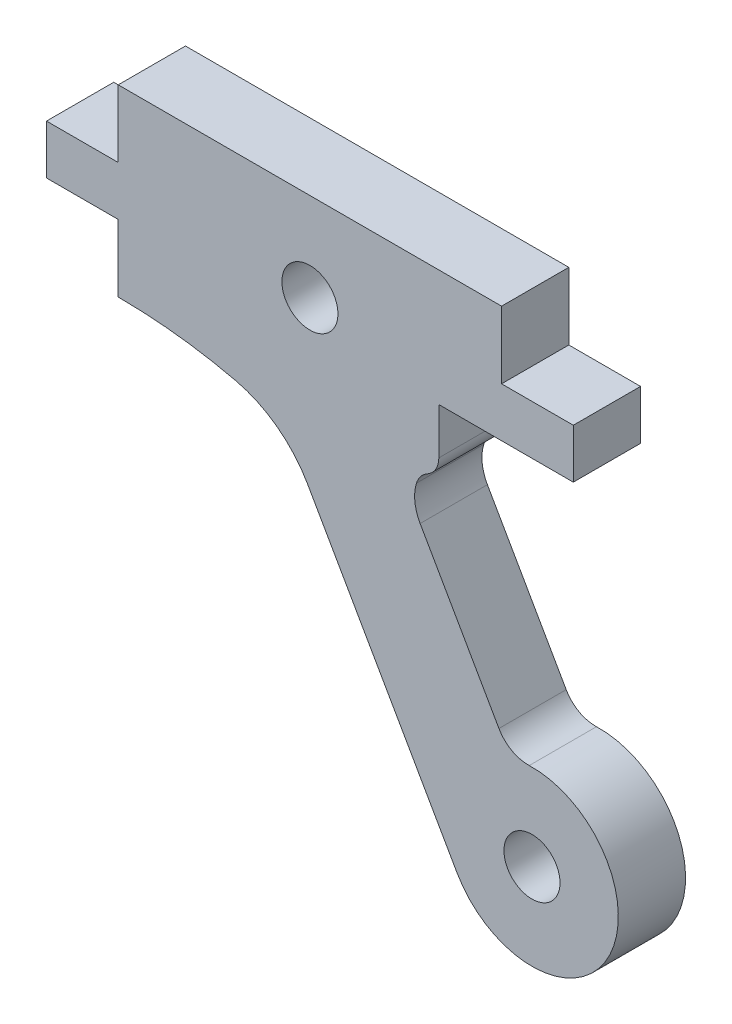
ISO-10303-21;
HEADER;
FILE_DESCRIPTION(('STEP AP214'),'2;1');
FILE_NAME('part.step','',(''),(''),'','','');
FILE_SCHEMA(('AUTOMOTIVE_DESIGN { 1 0 10303 214 1 1 1 1 }'));
ENDSEC;
DATA;
#1=APPLICATION_CONTEXT('core data for automotive mechanical design processes');
#2=APPLICATION_PROTOCOL_DEFINITION('international standard','automotive_design',2000,#1);
#3=PRODUCT_CONTEXT('',#1,'mechanical');
#4=PRODUCT('Part','Part','',(#3));
#5=PRODUCT_RELATED_PRODUCT_CATEGORY('part','',(#4));
#6=PRODUCT_DEFINITION_FORMATION('','',#4);
#7=PRODUCT_DEFINITION_CONTEXT('part definition',#1,'design');
#8=PRODUCT_DEFINITION('design','',#6,#7);
#9=PRODUCT_DEFINITION_SHAPE('','',#8);
#10=(LENGTH_UNIT() NAMED_UNIT(*) SI_UNIT(.MILLI.,.METRE.));
#11=(NAMED_UNIT(*) PLANE_ANGLE_UNIT() SI_UNIT($,.RADIAN.));
#12=(NAMED_UNIT(*) SI_UNIT($,.STERADIAN.) SOLID_ANGLE_UNIT());
#13=UNCERTAINTY_MEASURE_WITH_UNIT(LENGTH_MEASURE(1.E-05),#10,'distance_accuracy_value','');
#14=(GEOMETRIC_REPRESENTATION_CONTEXT(3) GLOBAL_UNCERTAINTY_ASSIGNED_CONTEXT((#13)) GLOBAL_UNIT_ASSIGNED_CONTEXT((#10,
#11,#12)) REPRESENTATION_CONTEXT('',''));
#15=CARTESIAN_POINT('',(0.,0.,0.));
#16=DIRECTION('',(0.,0.,1.));
#17=DIRECTION('',(1.,0.,0.));
#18=AXIS2_PLACEMENT_3D('',#15,#16,#17);
#19=CARTESIAN_POINT('',(-8.5499999999949,-27.1930824881454,3.));
#20=DIRECTION('',(0.,0.,1.));
#21=DIRECTION('',(1.,0.,0.));
#22=AXIS2_PLACEMENT_3D('',#19,#20,#21);
#23=PLANE('',#22);
#24=CARTESIAN_POINT('',(9.90717122357579,-17.027564662827,3.));
#25=DIRECTION('',(0.,0.,1.));
#26=DIRECTION('',(1.,0.,0.));
#27=AXIS2_PLACEMENT_3D('',#24,#25,#26);
#28=CIRCLE('',#27,1.25);
#29=CARTESIAN_POINT('',(11.1571712235758,-17.027564662827,3.));
#30=VERTEX_POINT('',#29);
#31=EDGE_CURVE('E205',#30,#30,#28,.T.);
#32=ORIENTED_EDGE('',*,*,#31,.F.);
#33=EDGE_LOOP('',(#32));
#34=FACE_BOUND('',#33,.T.);
#35=DIRECTION('',(-1.,0.,0.));
#36=VECTOR('',#35,1.);
#37=CARTESIAN_POINT('',(8.54999999999958,3.95000000000043,3.));
#38=LINE('',#37,#36);
#39=CARTESIAN_POINT('',(8.54999999999958,3.95000000000043,3.));
#40=VERTEX_POINT('',#39);
#41=CARTESIAN_POINT('',(-8.55000000000043,3.94999999999989,3.));
#42=VERTEX_POINT('',#41);
#43=EDGE_CURVE('E240',#40,#42,#38,.T.);
#44=ORIENTED_EDGE('',*,*,#43,.T.);
#45=DIRECTION('',(0.,-1.,0.));
#46=VECTOR('',#45,1.);
#47=CARTESIAN_POINT('',(-8.55000000000043,3.94999999999989,3.));
#48=LINE('',#47,#46);
#49=CARTESIAN_POINT('',(-8.55000000000035,0.949999999999882,3.));
#50=VERTEX_POINT('',#49);
#51=EDGE_CURVE('E128',#42,#50,#48,.T.);
#52=ORIENTED_EDGE('',*,*,#51,.T.);
#53=DIRECTION('',(-1.,0.,0.));
#54=VECTOR('',#53,1.);
#55=CARTESIAN_POINT('',(-8.55000000000035,0.949999999999882,3.));
#56=LINE('',#55,#54);
#57=CARTESIAN_POINT('',(-11.7500000000004,0.94999999999987,3.));
#58=VERTEX_POINT('',#57);
#59=EDGE_CURVE('E291',#50,#58,#56,.T.);
#60=ORIENTED_EDGE('',*,*,#59,.T.);
#61=DIRECTION('',(0.,-1.,0.));
#62=VECTOR('',#61,1.);
#63=CARTESIAN_POINT('',(-11.7500000000004,0.94999999999987,3.));
#64=LINE('',#63,#62);
#65=CARTESIAN_POINT('',(-11.7500000000003,-1.25000000000011,3.));
#66=VERTEX_POINT('',#65);
#67=EDGE_CURVE('E310',#58,#66,#64,.T.);
#68=ORIENTED_EDGE('',*,*,#67,.T.);
#69=DIRECTION('',(1.,0.,0.));
#70=VECTOR('',#69,1.);
#71=CARTESIAN_POINT('',(-11.7500000000003,-1.25000000000011,3.));
#72=LINE('',#71,#70);
#73=CARTESIAN_POINT('',(-8.5500000000003,-1.2500000000001,3.));
#74=VERTEX_POINT('',#73);
#75=EDGE_CURVE('E307',#66,#74,#72,.T.);
#76=ORIENTED_EDGE('',*,*,#75,.T.);
#77=DIRECTION('',(0.,-1.,0.));
#78=VECTOR('',#77,1.);
#79=CARTESIAN_POINT('',(-8.5500000000003,-1.2500000000001,3.));
#80=LINE('',#79,#78);
#81=CARTESIAN_POINT('',(-8.55000000000022,-4.25000000000021,3.));
#82=VERTEX_POINT('',#81);
#83=EDGE_CURVE('E309',#74,#82,#80,.T.);
#84=ORIENTED_EDGE('',*,*,#83,.T.);
#85=CARTESIAN_POINT('',(-8.5499999999949,-27.1930824881454,3.));
#86=DIRECTION('',(0.,0.,-1.));
#87=DIRECTION('',(1.,0.,0.));
#88=AXIS2_PLACEMENT_3D('',#85,#86,#87);
#89=CIRCLE('',#88,22.9430824881453);
#90=CARTESIAN_POINT('',(-3.30591056972596,-4.85735863362978,3.));
#91=VERTEX_POINT('',#90);
#92=EDGE_CURVE('E312',#82,#91,#89,.T.);
#93=ORIENTED_EDGE('',*,*,#92,.T.);
#94=CARTESIAN_POINT('',(-4.44990190647512,-9.72986794708752,3.));
#95=DIRECTION('',(0.,0.,-1.));
#96=DIRECTION('',(1.,0.,0.));
#97=AXIS2_PLACEMENT_3D('',#94,#95,#96);
#98=CIRCLE('',#97,5.00500381501255);
#99=CARTESIAN_POINT('',(-0.102452291666491,-7.25000000000033,3.));
#100=VERTEX_POINT('',#99);
#101=EDGE_CURVE('E318',#91,#100,#98,.T.);
#102=ORIENTED_EDGE('',*,*,#101,.T.);
#103=DIRECTION('',(0.495477733633113,-0.868620639562401,0.));
#104=VECTOR('',#103,1.);
#105=CARTESIAN_POINT('',(-0.102452291666477,-7.25000000000033,3.));
#106=LINE('',#105,#104);
#107=CARTESIAN_POINT('',(6.56298176126047,-18.9351539373144,3.));
#108=VERTEX_POINT('',#107);
#109=EDGE_CURVE('E320',#100,#108,#106,.T.);
#110=ORIENTED_EDGE('',*,*,#109,.T.);
#111=CARTESIAN_POINT('',(9.90717122357579,-17.027564662827,3.));
#112=DIRECTION('',(0.,0.,1.));
#113=DIRECTION('',(1.,0.,0.));
#114=AXIS2_PLACEMENT_3D('',#111,#112,#113);
#115=CIRCLE('',#114,3.85000000000012);
#116=CARTESIAN_POINT('',(9.78336880245243,-13.1795557022702,3.));
#117=VERTEX_POINT('',#116);
#118=EDGE_CURVE('E322',#108,#117,#115,.T.);
#119=ORIENTED_EDGE('',*,*,#118,.T.);
#120=CARTESIAN_POINT('',(9.73513409292387,-11.6803314319235,3.));
#121=DIRECTION('',(0.,0.,-1.));
#122=DIRECTION('',(1.,0.,0.));
#123=AXIS2_PLACEMENT_3D('',#120,#121,#122);
#124=CIRCLE('',#123,1.49999999999998);
#125=CARTESIAN_POINT('',(8.43220313358019,-12.423548032373,3.));
#126=VERTEX_POINT('',#125);
#127=EDGE_CURVE('E324',#117,#126,#124,.T.);
#128=ORIENTED_EDGE('',*,*,#127,.T.);
#129=DIRECTION('',(-0.495477733633112,0.868620639562401,0.));
#130=VECTOR('',#129,1.);
#131=CARTESIAN_POINT('',(8.43220313358015,-12.423548032373,3.));
#132=LINE('',#131,#130);
#133=CARTESIAN_POINT('',(4.91779770312153,-6.26245362697442,3.));
#134=VERTEX_POINT('',#133);
#135=EDGE_CURVE('E326',#126,#134,#132,.T.);
#136=ORIENTED_EDGE('',*,*,#135,.T.);
#137=CARTESIAN_POINT('',(6.54173589386581,-5.33612839630127,3.));
#138=DIRECTION('',(0.,0.,-1.));
#139=DIRECTION('',(1.,0.,0.));
#140=AXIS2_PLACEMENT_3D('',#137,#138,#139);
#141=CIRCLE('',#140,1.86955975575522);
#142=CARTESIAN_POINT('',(4.75604553181221,-4.78244652806972,3.));
#143=VERTEX_POINT('',#142);
#144=EDGE_CURVE('E328',#134,#143,#141,.T.);
#145=ORIENTED_EDGE('',*,*,#144,.T.);
#146=CARTESIAN_POINT('',(5.75000000000001,-5.09063801444276,3.));
#147=DIRECTION('',(0.,0.,-1.));
#148=DIRECTION('',(1.,0.,0.));
#149=AXIS2_PLACEMENT_3D('',#146,#147,#148);
#150=CIRCLE('',#149,1.04063801444274);
#151=CARTESIAN_POINT('',(5.24004281647327,-4.18351555960394,3.));
#152=VERTEX_POINT('',#151);
#153=EDGE_CURVE('E330',#143,#152,#150,.T.);
#154=ORIENTED_EDGE('',*,*,#153,.T.);
#155=CARTESIAN_POINT('',(4.75,-3.31181719547624,3.));
#156=DIRECTION('',(0.,0.,1.));
#157=DIRECTION('',(1.,0.,0.));
#158=AXIS2_PLACEMENT_3D('',#155,#156,#157);
#159=CIRCLE('',#158,0.999999999999985);
#160=CARTESIAN_POINT('',(5.74999999999999,-3.31181719547624,3.));
#161=VERTEX_POINT('',#160);
#162=EDGE_CURVE('E332',#152,#161,#159,.T.);
#163=ORIENTED_EDGE('',*,*,#162,.T.);
#164=DIRECTION('',(-1.02224825165694E-13,1.,0.));
#165=VECTOR('',#164,1.);
#166=CARTESIAN_POINT('',(5.74999999999999,-3.31181719547602,3.));
#167=LINE('',#166,#165);
#168=CARTESIAN_POINT('',(5.74999999999978,-1.24999999999975,3.));
#169=VERTEX_POINT('',#168);
#170=EDGE_CURVE('E334',#161,#169,#167,.T.);
#171=ORIENTED_EDGE('',*,*,#170,.T.);
#172=DIRECTION('',(1.,0.,0.));
#173=VECTOR('',#172,1.);
#174=CARTESIAN_POINT('',(5.74999999999978,-1.24999999999975,3.));
#175=LINE('',#174,#173);
#176=CARTESIAN_POINT('',(11.7499999999998,-1.24999999999949,3.));
#177=VERTEX_POINT('',#176);
#178=EDGE_CURVE('E183',#169,#177,#175,.T.);
#179=ORIENTED_EDGE('',*,*,#178,.T.);
#180=DIRECTION('',(0.,1.,0.));
#181=VECTOR('',#180,1.);
#182=CARTESIAN_POINT('',(11.7499999999998,-1.24999999999949,3.));
#183=LINE('',#182,#181);
#184=CARTESIAN_POINT('',(11.7499999999999,0.950000000000492,3.));
#185=VERTEX_POINT('',#184);
#186=EDGE_CURVE('E177',#177,#185,#183,.T.);
#187=ORIENTED_EDGE('',*,*,#186,.T.);
#188=DIRECTION('',(-1.,0.,0.));
#189=VECTOR('',#188,1.);
#190=CARTESIAN_POINT('',(11.7499999999999,0.950000000000492,3.));
#191=LINE('',#190,#189);
#192=CARTESIAN_POINT('',(8.54999999999987,0.950000000000424,3.));
#193=VERTEX_POINT('',#192);
#194=EDGE_CURVE('E181',#185,#193,#191,.T.);
#195=ORIENTED_EDGE('',*,*,#194,.T.);
#196=DIRECTION('',(0.,1.,0.));
#197=VECTOR('',#196,1.);
#198=CARTESIAN_POINT('',(8.54999999999987,0.950000000000424,3.));
#199=LINE('',#198,#197);
#200=EDGE_CURVE('E49',#193,#40,#199,.T.);
#201=ORIENTED_EDGE('',*,*,#200,.T.);
#202=EDGE_LOOP('',(#44,#52,#60,#68,#76,#84,#93,#102,#110,#119,#128,#136,#145,#154,#163,#171,
#179,#187,#195,#201));
#203=FACE_BOUND('',#202,.T.);
#204=CARTESIAN_POINT('',(0.,0.,3.));
#205=DIRECTION('',(0.,0.,1.));
#206=DIRECTION('',(1.,0.,0.));
#207=AXIS2_PLACEMENT_3D('',#204,#205,#206);
#208=CIRCLE('',#207,1.25);
#209=CARTESIAN_POINT('',(1.25,0.,3.));
#210=VERTEX_POINT('',#209);
#211=EDGE_CURVE('E376',#210,#210,#208,.T.);
#212=ORIENTED_EDGE('',*,*,#211,.F.);
#213=EDGE_LOOP('',(#212));
#214=FACE_BOUND('',#213,.T.);
#215=ADVANCED_FACE('F32',(#34,#203,#214),#23,.T.);
#216=CARTESIAN_POINT('',(-8.5499999999949,-27.1930824881454,0.));
#217=DIRECTION('',(0.,0.,1.));
#218=DIRECTION('',(1.,0.,0.));
#219=AXIS2_PLACEMENT_3D('',#216,#217,#218);
#220=PLANE('',#219);
#221=DIRECTION('',(-1.,0.,0.));
#222=VECTOR('',#221,1.);
#223=CARTESIAN_POINT('',(8.54999999999958,3.95000000000043,0.));
#224=LINE('',#223,#222);
#225=CARTESIAN_POINT('',(8.54999999999958,3.95000000000043,0.));
#226=VERTEX_POINT('',#225);
#227=CARTESIAN_POINT('',(-8.55000000000043,3.94999999999989,0.));
#228=VERTEX_POINT('',#227);
#229=EDGE_CURVE('E201',#226,#228,#224,.T.);
#230=ORIENTED_EDGE('',*,*,#229,.F.);
#231=DIRECTION('',(0.,1.,0.));
#232=VECTOR('',#231,1.);
#233=CARTESIAN_POINT('',(8.54999999999987,0.950000000000424,0.));
#234=LINE('',#233,#232);
#235=CARTESIAN_POINT('',(8.54999999999987,0.950000000000424,0.));
#236=VERTEX_POINT('',#235);
#237=EDGE_CURVE('E120',#236,#226,#234,.T.);
#238=ORIENTED_EDGE('',*,*,#237,.F.);
#239=DIRECTION('',(-1.,0.,0.));
#240=VECTOR('',#239,1.);
#241=CARTESIAN_POINT('',(11.7499999999999,0.950000000000492,0.));
#242=LINE('',#241,#240);
#243=CARTESIAN_POINT('',(11.7499999999999,0.950000000000492,0.));
#244=VERTEX_POINT('',#243);
#245=EDGE_CURVE('E114',#244,#236,#242,.T.);
#246=ORIENTED_EDGE('',*,*,#245,.F.);
#247=DIRECTION('',(0.,1.,0.));
#248=VECTOR('',#247,1.);
#249=CARTESIAN_POINT('',(11.7499999999998,-1.24999999999949,0.));
#250=LINE('',#249,#248);
#251=CARTESIAN_POINT('',(11.7499999999998,-1.24999999999949,0.));
#252=VERTEX_POINT('',#251);
#253=EDGE_CURVE('E191',#252,#244,#250,.T.);
#254=ORIENTED_EDGE('',*,*,#253,.F.);
#255=DIRECTION('',(1.,0.,0.));
#256=VECTOR('',#255,1.);
#257=CARTESIAN_POINT('',(5.74999999999978,-1.24999999999975,0.));
#258=LINE('',#257,#256);
#259=CARTESIAN_POINT('',(5.74999999999978,-1.24999999999975,0.));
#260=VERTEX_POINT('',#259);
#261=EDGE_CURVE('E235',#260,#252,#258,.T.);
#262=ORIENTED_EDGE('',*,*,#261,.F.);
#263=DIRECTION('',(-1.02224825165694E-13,1.,0.));
#264=VECTOR('',#263,1.);
#265=CARTESIAN_POINT('',(5.74999999999999,-3.31181719547602,0.));
#266=LINE('',#265,#264);
#267=CARTESIAN_POINT('',(5.74999999999999,-3.31181719547624,0.));
#268=VERTEX_POINT('',#267);
#269=EDGE_CURVE('E233',#268,#260,#266,.T.);
#270=ORIENTED_EDGE('',*,*,#269,.F.);
#271=CARTESIAN_POINT('',(4.75,-3.31181719547624,0.));
#272=DIRECTION('',(0.,0.,1.));
#273=DIRECTION('',(1.,0.,0.));
#274=AXIS2_PLACEMENT_3D('',#271,#272,#273);
#275=CIRCLE('',#274,0.999999999999985);
#276=CARTESIAN_POINT('',(5.24004281647327,-4.18351555960394,0.));
#277=VERTEX_POINT('',#276);
#278=EDGE_CURVE('E231',#277,#268,#275,.T.);
#279=ORIENTED_EDGE('',*,*,#278,.F.);
#280=CARTESIAN_POINT('',(5.75000000000001,-5.09063801444276,0.));
#281=DIRECTION('',(0.,0.,-1.));
#282=DIRECTION('',(1.,0.,0.));
#283=AXIS2_PLACEMENT_3D('',#280,#281,#282);
#284=CIRCLE('',#283,1.04063801444274);
#285=CARTESIAN_POINT('',(4.75604553181221,-4.78244652806972,0.));
#286=VERTEX_POINT('',#285);
#287=EDGE_CURVE('E229',#286,#277,#284,.T.);
#288=ORIENTED_EDGE('',*,*,#287,.F.);
#289=CARTESIAN_POINT('',(6.54173589386581,-5.33612839630127,0.));
#290=DIRECTION('',(0.,0.,-1.));
#291=DIRECTION('',(1.,0.,0.));
#292=AXIS2_PLACEMENT_3D('',#289,#290,#291);
#293=CIRCLE('',#292,1.86955975575522);
#294=CARTESIAN_POINT('',(4.91779770312153,-6.26245362697442,0.));
#295=VERTEX_POINT('',#294);
#296=EDGE_CURVE('E227',#295,#286,#293,.T.);
#297=ORIENTED_EDGE('',*,*,#296,.F.);
#298=DIRECTION('',(-0.495477733633112,0.868620639562401,0.));
#299=VECTOR('',#298,1.);
#300=CARTESIAN_POINT('',(8.43220313358015,-12.423548032373,0.));
#301=LINE('',#300,#299);
#302=CARTESIAN_POINT('',(8.43220313358019,-12.423548032373,0.));
#303=VERTEX_POINT('',#302);
#304=EDGE_CURVE('E225',#303,#295,#301,.T.);
#305=ORIENTED_EDGE('',*,*,#304,.F.);
#306=CARTESIAN_POINT('',(9.73513409292387,-11.6803314319235,0.));
#307=DIRECTION('',(0.,0.,-1.));
#308=DIRECTION('',(1.,0.,0.));
#309=AXIS2_PLACEMENT_3D('',#306,#307,#308);
#310=CIRCLE('',#309,1.49999999999998);
#311=CARTESIAN_POINT('',(9.78336880245243,-13.1795557022702,0.));
#312=VERTEX_POINT('',#311);
#313=EDGE_CURVE('E223',#312,#303,#310,.T.);
#314=ORIENTED_EDGE('',*,*,#313,.F.);
#315=CARTESIAN_POINT('',(9.90717122357579,-17.027564662827,0.));
#316=DIRECTION('',(0.,0.,1.));
#317=DIRECTION('',(1.,0.,0.));
#318=AXIS2_PLACEMENT_3D('',#315,#316,#317);
#319=CIRCLE('',#318,3.85000000000012);
#320=CARTESIAN_POINT('',(6.56298176126047,-18.9351539373144,0.));
#321=VERTEX_POINT('',#320);
#322=EDGE_CURVE('E221',#321,#312,#319,.T.);
#323=ORIENTED_EDGE('',*,*,#322,.F.);
#324=DIRECTION('',(0.495477733633113,-0.868620639562401,0.));
#325=VECTOR('',#324,1.);
#326=CARTESIAN_POINT('',(-0.102452291666477,-7.25000000000033,0.));
#327=LINE('',#326,#325);
#328=CARTESIAN_POINT('',(-0.102452291666491,-7.25000000000033,0.));
#329=VERTEX_POINT('',#328);
#330=EDGE_CURVE('E219',#329,#321,#327,.T.);
#331=ORIENTED_EDGE('',*,*,#330,.F.);
#332=CARTESIAN_POINT('',(-4.44990190647512,-9.72986794708752,0.));
#333=DIRECTION('',(0.,0.,-1.));
#334=DIRECTION('',(1.,0.,0.));
#335=AXIS2_PLACEMENT_3D('',#332,#333,#334);
#336=CIRCLE('',#335,5.00500381501255);
#337=CARTESIAN_POINT('',(-3.30591056972596,-4.85735863362978,0.));
#338=VERTEX_POINT('',#337);
#339=EDGE_CURVE('E217',#338,#329,#336,.T.);
#340=ORIENTED_EDGE('',*,*,#339,.F.);
#341=CARTESIAN_POINT('',(-8.5499999999949,-27.1930824881454,0.));
#342=DIRECTION('',(0.,0.,-1.));
#343=DIRECTION('',(1.,0.,0.));
#344=AXIS2_PLACEMENT_3D('',#341,#342,#343);
#345=CIRCLE('',#344,22.9430824881453);
#346=CARTESIAN_POINT('',(-8.55000000000022,-4.25000000000021,0.));
#347=VERTEX_POINT('',#346);
#348=EDGE_CURVE('E215',#347,#338,#345,.T.);
#349=ORIENTED_EDGE('',*,*,#348,.F.);
#350=DIRECTION('',(0.,-1.,0.));
#351=VECTOR('',#350,1.);
#352=CARTESIAN_POINT('',(-8.5500000000003,-1.2500000000001,0.));
#353=LINE('',#352,#351);
#354=CARTESIAN_POINT('',(-8.5500000000003,-1.2500000000001,0.));
#355=VERTEX_POINT('',#354);
#356=EDGE_CURVE('E213',#355,#347,#353,.T.);
#357=ORIENTED_EDGE('',*,*,#356,.F.);
#358=DIRECTION('',(1.,0.,0.));
#359=VECTOR('',#358,1.);
#360=CARTESIAN_POINT('',(-11.7500000000003,-1.25000000000011,0.));
#361=LINE('',#360,#359);
#362=CARTESIAN_POINT('',(-11.7500000000003,-1.25000000000011,0.));
#363=VERTEX_POINT('',#362);
#364=EDGE_CURVE('E211',#363,#355,#361,.T.);
#365=ORIENTED_EDGE('',*,*,#364,.F.);
#366=DIRECTION('',(0.,-1.,0.));
#367=VECTOR('',#366,1.);
#368=CARTESIAN_POINT('',(-11.7500000000004,0.94999999999987,0.));
#369=LINE('',#368,#367);
#370=CARTESIAN_POINT('',(-11.7500000000004,0.94999999999987,0.));
#371=VERTEX_POINT('',#370);
#372=EDGE_CURVE('E209',#371,#363,#369,.T.);
#373=ORIENTED_EDGE('',*,*,#372,.F.);
#374=DIRECTION('',(-1.,0.,0.));
#375=VECTOR('',#374,1.);
#376=CARTESIAN_POINT('',(-8.55000000000035,0.949999999999882,0.));
#377=LINE('',#376,#375);
#378=CARTESIAN_POINT('',(-8.55000000000035,0.949999999999882,0.));
#379=VERTEX_POINT('',#378);
#380=EDGE_CURVE('E207',#379,#371,#377,.T.);
#381=ORIENTED_EDGE('',*,*,#380,.F.);
#382=DIRECTION('',(0.,-1.,0.));
#383=VECTOR('',#382,1.);
#384=CARTESIAN_POINT('',(-8.55000000000043,3.94999999999989,0.));
#385=LINE('',#384,#383);
#386=EDGE_CURVE('E204',#228,#379,#385,.T.);
#387=ORIENTED_EDGE('',*,*,#386,.F.);
#388=EDGE_LOOP('',(#230,#238,#246,#254,#262,#270,#279,#288,#297,#305,#314,#323,#331,#340,#349,
#357,#365,#373,#381,#387));
#389=FACE_BOUND('',#388,.T.);
#390=CARTESIAN_POINT('',(9.90717122357579,-17.027564662827,0.));
#391=DIRECTION('',(0.,0.,1.));
#392=DIRECTION('',(1.,0.,0.));
#393=AXIS2_PLACEMENT_3D('',#390,#391,#392);
#394=CIRCLE('',#393,1.25);
#395=CARTESIAN_POINT('',(11.1571712235758,-17.027564662827,0.));
#396=VERTEX_POINT('',#395);
#397=EDGE_CURVE('E382',#396,#396,#394,.T.);
#398=ORIENTED_EDGE('',*,*,#397,.T.);
#399=EDGE_LOOP('',(#398));
#400=FACE_BOUND('',#399,.T.);
#401=CARTESIAN_POINT('',(0.,0.,0.));
#402=DIRECTION('',(0.,0.,1.));
#403=DIRECTION('',(1.,0.,0.));
#404=AXIS2_PLACEMENT_3D('',#401,#402,#403);
#405=CIRCLE('',#404,1.25);
#406=CARTESIAN_POINT('',(1.25,0.,0.));
#407=VERTEX_POINT('',#406);
#408=EDGE_CURVE('E379',#407,#407,#405,.T.);
#409=ORIENTED_EDGE('',*,*,#408,.T.);
#410=EDGE_LOOP('',(#409));
#411=FACE_BOUND('',#410,.T.);
#412=ADVANCED_FACE('F295',(#389,#400,#411),#220,.F.);
#413=CARTESIAN_POINT('',(8.54999999999958,3.95000000000043,3.));
#414=DIRECTION('',(0.,-1.,0.));
#415=DIRECTION('',(1.,0.,0.));
#416=AXIS2_PLACEMENT_3D('',#413,#414,#415);
#417=PLANE('',#416);
#418=ORIENTED_EDGE('',*,*,#229,.T.);
#419=DIRECTION('',(0.,0.,-1.));
#420=VECTOR('',#419,1.);
#421=CARTESIAN_POINT('',(-8.55000000000043,3.94999999999989,3.));
#422=LINE('',#421,#420);
#423=EDGE_CURVE('E11',#42,#228,#422,.T.);
#424=ORIENTED_EDGE('',*,*,#423,.F.);
#425=ORIENTED_EDGE('',*,*,#43,.F.);
#426=DIRECTION('',(0.,0.,-1.));
#427=VECTOR('',#426,1.);
#428=CARTESIAN_POINT('',(8.54999999999958,3.95000000000043,3.));
#429=LINE('',#428,#427);
#430=EDGE_CURVE('E197',#40,#226,#429,.T.);
#431=ORIENTED_EDGE('',*,*,#430,.T.);
#432=EDGE_LOOP('',(#418,#424,#425,#431));
#433=FACE_BOUND('',#432,.T.);
#434=ADVANCED_FACE('F34',(#433),#417,.F.);
#435=CARTESIAN_POINT('',(-8.55000000000043,3.94999999999989,3.));
#436=DIRECTION('',(1.,0.,0.));
#437=DIRECTION('',(0.,1.,0.));
#438=AXIS2_PLACEMENT_3D('',#435,#436,#437);
#439=PLANE('',#438);
#440=ORIENTED_EDGE('',*,*,#386,.T.);
#441=DIRECTION('',(0.,0.,-1.));
#442=VECTOR('',#441,1.);
#443=CARTESIAN_POINT('',(-8.55000000000035,0.949999999999882,3.));
#444=LINE('',#443,#442);
#445=EDGE_CURVE('E41',#50,#379,#444,.T.);
#446=ORIENTED_EDGE('',*,*,#445,.F.);
#447=ORIENTED_EDGE('',*,*,#51,.F.);
#448=ORIENTED_EDGE('',*,*,#423,.T.);
#449=EDGE_LOOP('',(#440,#446,#447,#448));
#450=FACE_BOUND('',#449,.T.);
#451=ADVANCED_FACE('F555',(#450),#439,.F.);
#452=CARTESIAN_POINT('',(-8.55000000000035,0.949999999999882,3.));
#453=DIRECTION('',(0.,-1.,0.));
#454=DIRECTION('',(1.,0.,0.));
#455=AXIS2_PLACEMENT_3D('',#452,#453,#454);
#456=PLANE('',#455);
#457=ORIENTED_EDGE('',*,*,#380,.T.);
#458=DIRECTION('',(0.,0.,-1.));
#459=VECTOR('',#458,1.);
#460=CARTESIAN_POINT('',(-11.7500000000004,0.94999999999987,3.));
#461=LINE('',#460,#459);
#462=EDGE_CURVE('E283',#58,#371,#461,.T.);
#463=ORIENTED_EDGE('',*,*,#462,.F.);
#464=ORIENTED_EDGE('',*,*,#59,.F.);
#465=ORIENTED_EDGE('',*,*,#445,.T.);
#466=EDGE_LOOP('',(#457,#463,#464,#465));
#467=FACE_BOUND('',#466,.T.);
#468=ADVANCED_FACE('F289',(#467),#456,.F.);
#469=CARTESIAN_POINT('',(-11.7500000000004,0.94999999999987,3.));
#470=DIRECTION('',(1.,0.,0.));
#471=DIRECTION('',(0.,1.,0.));
#472=AXIS2_PLACEMENT_3D('',#469,#470,#471);
#473=PLANE('',#472);
#474=ORIENTED_EDGE('',*,*,#372,.T.);
#475=DIRECTION('',(0.,0.,-1.));
#476=VECTOR('',#475,1.);
#477=CARTESIAN_POINT('',(-11.7500000000003,-1.25000000000011,3.));
#478=LINE('',#477,#476);
#479=EDGE_CURVE('E280',#66,#363,#478,.T.);
#480=ORIENTED_EDGE('',*,*,#479,.F.);
#481=ORIENTED_EDGE('',*,*,#67,.F.);
#482=ORIENTED_EDGE('',*,*,#462,.T.);
#483=EDGE_LOOP('',(#474,#480,#481,#482));
#484=FACE_BOUND('',#483,.T.);
#485=ADVANCED_FACE('F301',(#484),#473,.F.);
#486=CARTESIAN_POINT('',(-11.7500000000003,-1.25000000000011,3.));
#487=DIRECTION('',(0.,1.,0.));
#488=DIRECTION('',(-1.,0.,0.));
#489=AXIS2_PLACEMENT_3D('',#486,#487,#488);
#490=PLANE('',#489);
#491=ORIENTED_EDGE('',*,*,#364,.T.);
#492=DIRECTION('',(0.,0.,-1.));
#493=VECTOR('',#492,1.);
#494=CARTESIAN_POINT('',(-8.5500000000003,-1.2500000000001,3.));
#495=LINE('',#494,#493);
#496=EDGE_CURVE('E277',#74,#355,#495,.T.);
#497=ORIENTED_EDGE('',*,*,#496,.F.);
#498=ORIENTED_EDGE('',*,*,#75,.F.);
#499=ORIENTED_EDGE('',*,*,#479,.T.);
#500=EDGE_LOOP('',(#491,#497,#498,#499));
#501=FACE_BOUND('',#500,.T.);
#502=ADVANCED_FACE('F305',(#501),#490,.F.);
#503=CARTESIAN_POINT('',(-8.5500000000003,-1.2500000000001,3.));
#504=DIRECTION('',(1.,0.,0.));
#505=DIRECTION('',(0.,1.,0.));
#506=AXIS2_PLACEMENT_3D('',#503,#504,#505);
#507=PLANE('',#506);
#508=ORIENTED_EDGE('',*,*,#356,.T.);
#509=DIRECTION('',(0.,0.,-1.));
#510=VECTOR('',#509,1.);
#511=CARTESIAN_POINT('',(-8.55000000000022,-4.25000000000021,3.));
#512=LINE('',#511,#510);
#513=EDGE_CURVE('E274',#82,#347,#512,.T.);
#514=ORIENTED_EDGE('',*,*,#513,.F.);
#515=ORIENTED_EDGE('',*,*,#83,.F.);
#516=ORIENTED_EDGE('',*,*,#496,.T.);
#517=EDGE_LOOP('',(#508,#514,#515,#516));
#518=FACE_BOUND('',#517,.T.);
#519=ADVANCED_FACE('F520',(#518),#507,.F.);
#520=CARTESIAN_POINT('',(-8.5499999999949,-27.1930824881454,3.));
#521=DIRECTION('',(0.,0.,-1.));
#522=DIRECTION('',(-1.,0.,0.));
#523=AXIS2_PLACEMENT_3D('',#520,#521,#522);
#524=CYLINDRICAL_SURFACE('',#523,22.9430824881453);
#525=ORIENTED_EDGE('',*,*,#348,.T.);
#526=DIRECTION('',(0.,0.,-1.));
#527=VECTOR('',#526,1.);
#528=CARTESIAN_POINT('',(-3.30591056972596,-4.85735863362978,3.));
#529=LINE('',#528,#527);
#530=EDGE_CURVE('E271',#91,#338,#529,.T.);
#531=ORIENTED_EDGE('',*,*,#530,.F.);
#532=ORIENTED_EDGE('',*,*,#92,.F.);
#533=ORIENTED_EDGE('',*,*,#513,.T.);
#534=EDGE_LOOP('',(#525,#531,#532,#533));
#535=FACE_BOUND('',#534,.T.);
#536=ADVANCED_FACE('F510',(#535),#524,.F.);
#537=CARTESIAN_POINT('',(-4.44990190647512,-9.72986794708752,3.));
#538=DIRECTION('',(0.,0.,-1.));
#539=DIRECTION('',(-1.,0.,0.));
#540=AXIS2_PLACEMENT_3D('',#537,#538,#539);
#541=CYLINDRICAL_SURFACE('',#540,5.00500381501255);
#542=ORIENTED_EDGE('',*,*,#339,.T.);
#543=DIRECTION('',(0.,0.,-1.));
#544=VECTOR('',#543,1.);
#545=CARTESIAN_POINT('',(-0.102452291666491,-7.25000000000033,3.));
#546=LINE('',#545,#544);
#547=EDGE_CURVE('E268',#100,#329,#546,.T.);
#548=ORIENTED_EDGE('',*,*,#547,.F.);
#549=ORIENTED_EDGE('',*,*,#101,.F.);
#550=ORIENTED_EDGE('',*,*,#530,.T.);
#551=EDGE_LOOP('',(#542,#548,#549,#550));
#552=FACE_BOUND('',#551,.T.);
#553=ADVANCED_FACE('F500',(#552),#541,.F.);
#554=CARTESIAN_POINT('',(-0.102452291666477,-7.25000000000033,3.));
#555=DIRECTION('',(0.868620639562401,0.495477733633113,0.));
#556=DIRECTION('',(-0.495477733633113,0.868620639562401,0.));
#557=AXIS2_PLACEMENT_3D('',#554,#555,#556);
#558=PLANE('',#557);
#559=ORIENTED_EDGE('',*,*,#330,.T.);
#560=DIRECTION('',(0.,0.,-1.));
#561=VECTOR('',#560,1.);
#562=CARTESIAN_POINT('',(6.56298176126047,-18.9351539373144,3.));
#563=LINE('',#562,#561);
#564=EDGE_CURVE('E265',#108,#321,#563,.T.);
#565=ORIENTED_EDGE('',*,*,#564,.F.);
#566=ORIENTED_EDGE('',*,*,#109,.F.);
#567=ORIENTED_EDGE('',*,*,#547,.T.);
#568=EDGE_LOOP('',(#559,#565,#566,#567));
#569=FACE_BOUND('',#568,.T.);
#570=ADVANCED_FACE('F490',(#569),#558,.F.);
#571=CARTESIAN_POINT('',(9.90717122357579,-17.027564662827,3.));
#572=DIRECTION('',(0.,0.,-1.));
#573=DIRECTION('',(-1.,0.,0.));
#574=AXIS2_PLACEMENT_3D('',#571,#572,#573);
#575=CYLINDRICAL_SURFACE('',#574,3.85000000000012);
#576=ORIENTED_EDGE('',*,*,#322,.T.);
#577=DIRECTION('',(0.,0.,-1.));
#578=VECTOR('',#577,1.);
#579=CARTESIAN_POINT('',(9.78336880245243,-13.1795557022702,3.));
#580=LINE('',#579,#578);
#581=EDGE_CURVE('E262',#117,#312,#580,.T.);
#582=ORIENTED_EDGE('',*,*,#581,.F.);
#583=ORIENTED_EDGE('',*,*,#118,.F.);
#584=ORIENTED_EDGE('',*,*,#564,.T.);
#585=EDGE_LOOP('',(#576,#582,#583,#584));
#586=FACE_BOUND('',#585,.T.);
#587=ADVANCED_FACE('F480',(#586),#575,.T.);
#588=CARTESIAN_POINT('',(9.73513409292387,-11.6803314319235,3.));
#589=DIRECTION('',(0.,0.,-1.));
#590=DIRECTION('',(-1.,0.,0.));
#591=AXIS2_PLACEMENT_3D('',#588,#589,#590);
#592=CYLINDRICAL_SURFACE('',#591,1.49999999999998);
#593=ORIENTED_EDGE('',*,*,#313,.T.);
#594=DIRECTION('',(0.,0.,-1.));
#595=VECTOR('',#594,1.);
#596=CARTESIAN_POINT('',(8.43220313358019,-12.423548032373,3.));
#597=LINE('',#596,#595);
#598=EDGE_CURVE('E259',#126,#303,#597,.T.);
#599=ORIENTED_EDGE('',*,*,#598,.F.);
#600=ORIENTED_EDGE('',*,*,#127,.F.);
#601=ORIENTED_EDGE('',*,*,#581,.T.);
#602=EDGE_LOOP('',(#593,#599,#600,#601));
#603=FACE_BOUND('',#602,.T.);
#604=ADVANCED_FACE('F470',(#603),#592,.F.);
#605=CARTESIAN_POINT('',(8.43220313358015,-12.423548032373,3.));
#606=DIRECTION('',(-0.868620639562401,-0.495477733633112,0.));
#607=DIRECTION('',(0.495477733633112,-0.868620639562401,0.));
#608=AXIS2_PLACEMENT_3D('',#605,#606,#607);
#609=PLANE('',#608);
#610=ORIENTED_EDGE('',*,*,#304,.T.);
#611=DIRECTION('',(0.,0.,-1.));
#612=VECTOR('',#611,1.);
#613=CARTESIAN_POINT('',(4.91779770312153,-6.26245362697442,3.));
#614=LINE('',#613,#612);
#615=EDGE_CURVE('E256',#134,#295,#614,.T.);
#616=ORIENTED_EDGE('',*,*,#615,.F.);
#617=ORIENTED_EDGE('',*,*,#135,.F.);
#618=ORIENTED_EDGE('',*,*,#598,.T.);
#619=EDGE_LOOP('',(#610,#616,#617,#618));
#620=FACE_BOUND('',#619,.T.);
#621=ADVANCED_FACE('F460',(#620),#609,.F.);
#622=CARTESIAN_POINT('',(6.54173589386581,-5.33612839630127,3.));
#623=DIRECTION('',(0.,0.,-1.));
#624=DIRECTION('',(-1.,0.,0.));
#625=AXIS2_PLACEMENT_3D('',#622,#623,#624);
#626=CYLINDRICAL_SURFACE('',#625,1.86955975575522);
#627=ORIENTED_EDGE('',*,*,#296,.T.);
#628=DIRECTION('',(0.,0.,-1.));
#629=VECTOR('',#628,1.);
#630=CARTESIAN_POINT('',(4.75604553181221,-4.78244652806972,3.));
#631=LINE('',#630,#629);
#632=EDGE_CURVE('E253',#143,#286,#631,.T.);
#633=ORIENTED_EDGE('',*,*,#632,.F.);
#634=ORIENTED_EDGE('',*,*,#144,.F.);
#635=ORIENTED_EDGE('',*,*,#615,.T.);
#636=EDGE_LOOP('',(#627,#633,#634,#635));
#637=FACE_BOUND('',#636,.T.);
#638=ADVANCED_FACE('F450',(#637),#626,.F.);
#639=CARTESIAN_POINT('',(5.75000000000001,-5.09063801444276,3.));
#640=DIRECTION('',(0.,0.,-1.));
#641=DIRECTION('',(-1.,0.,0.));
#642=AXIS2_PLACEMENT_3D('',#639,#640,#641);
#643=CYLINDRICAL_SURFACE('',#642,1.04063801444274);
#644=ORIENTED_EDGE('',*,*,#287,.T.);
#645=DIRECTION('',(0.,0.,-1.));
#646=VECTOR('',#645,1.);
#647=CARTESIAN_POINT('',(5.24004281647327,-4.18351555960394,3.));
#648=LINE('',#647,#646);
#649=EDGE_CURVE('E250',#152,#277,#648,.T.);
#650=ORIENTED_EDGE('',*,*,#649,.F.);
#651=ORIENTED_EDGE('',*,*,#153,.F.);
#652=ORIENTED_EDGE('',*,*,#632,.T.);
#653=EDGE_LOOP('',(#644,#650,#651,#652));
#654=FACE_BOUND('',#653,.T.);
#655=ADVANCED_FACE('F440',(#654),#643,.F.);
#656=CARTESIAN_POINT('',(4.75,-3.31181719547624,3.));
#657=DIRECTION('',(0.,0.,-1.));
#658=DIRECTION('',(-1.,0.,0.));
#659=AXIS2_PLACEMENT_3D('',#656,#657,#658);
#660=CYLINDRICAL_SURFACE('',#659,0.999999999999985);
#661=ORIENTED_EDGE('',*,*,#278,.T.);
#662=DIRECTION('',(0.,0.,-1.));
#663=VECTOR('',#662,1.);
#664=CARTESIAN_POINT('',(5.74999999999999,-3.31181719547624,3.));
#665=LINE('',#664,#663);
#666=EDGE_CURVE('E247',#161,#268,#665,.T.);
#667=ORIENTED_EDGE('',*,*,#666,.F.);
#668=ORIENTED_EDGE('',*,*,#162,.F.);
#669=ORIENTED_EDGE('',*,*,#649,.T.);
#670=EDGE_LOOP('',(#661,#667,#668,#669));
#671=FACE_BOUND('',#670,.T.);
#672=ADVANCED_FACE('F431',(#671),#660,.T.);
#673=CARTESIAN_POINT('',(5.74999999999999,-3.31181719547602,3.));
#674=DIRECTION('',(-1.,-1.02224825165694E-13,0.));
#675=DIRECTION('',(1.02224825165694E-13,-1.,0.));
#676=AXIS2_PLACEMENT_3D('',#673,#674,#675);
#677=PLANE('',#676);
#678=ORIENTED_EDGE('',*,*,#269,.T.);
#679=DIRECTION('',(0.,0.,-1.));
#680=VECTOR('',#679,1.);
#681=CARTESIAN_POINT('',(5.74999999999978,-1.24999999999975,3.));
#682=LINE('',#681,#680);
#683=EDGE_CURVE('E244',#169,#260,#682,.T.);
#684=ORIENTED_EDGE('',*,*,#683,.F.);
#685=ORIENTED_EDGE('',*,*,#170,.F.);
#686=ORIENTED_EDGE('',*,*,#666,.T.);
#687=EDGE_LOOP('',(#678,#684,#685,#686));
#688=FACE_BOUND('',#687,.T.);
#689=ADVANCED_FACE('F340',(#688),#677,.F.);
#690=CARTESIAN_POINT('',(5.74999999999978,-1.24999999999975,3.));
#691=DIRECTION('',(0.,1.,0.));
#692=DIRECTION('',(-1.,0.,0.));
#693=AXIS2_PLACEMENT_3D('',#690,#691,#692);
#694=PLANE('',#693);
#695=ORIENTED_EDGE('',*,*,#261,.T.);
#696=DIRECTION('',(0.,0.,-1.));
#697=VECTOR('',#696,1.);
#698=CARTESIAN_POINT('',(11.7499999999998,-1.24999999999949,3.));
#699=LINE('',#698,#697);
#700=EDGE_CURVE('E192',#177,#252,#699,.T.);
#701=ORIENTED_EDGE('',*,*,#700,.F.);
#702=ORIENTED_EDGE('',*,*,#178,.F.);
#703=ORIENTED_EDGE('',*,*,#683,.T.);
#704=EDGE_LOOP('',(#695,#701,#702,#703));
#705=FACE_BOUND('',#704,.T.);
#706=ADVANCED_FACE('F344',(#705),#694,.F.);
#707=CARTESIAN_POINT('',(11.7499999999998,-1.24999999999949,3.));
#708=DIRECTION('',(-1.,0.,0.));
#709=DIRECTION('',(0.,-1.,0.));
#710=AXIS2_PLACEMENT_3D('',#707,#708,#709);
#711=PLANE('',#710);
#712=ORIENTED_EDGE('',*,*,#253,.T.);
#713=DIRECTION('',(0.,0.,-1.));
#714=VECTOR('',#713,1.);
#715=CARTESIAN_POINT('',(11.7499999999999,0.950000000000492,3.));
#716=LINE('',#715,#714);
#717=EDGE_CURVE('E188',#185,#244,#716,.T.);
#718=ORIENTED_EDGE('',*,*,#717,.F.);
#719=ORIENTED_EDGE('',*,*,#186,.F.);
#720=ORIENTED_EDGE('',*,*,#700,.T.);
#721=EDGE_LOOP('',(#712,#718,#719,#720));
#722=FACE_BOUND('',#721,.T.);
#723=ADVANCED_FACE('F189',(#722),#711,.F.);
#724=CARTESIAN_POINT('',(11.7499999999999,0.950000000000492,3.));
#725=DIRECTION('',(0.,-1.,0.));
#726=DIRECTION('',(1.,0.,0.));
#727=AXIS2_PLACEMENT_3D('',#724,#725,#726);
#728=PLANE('',#727);
#729=ORIENTED_EDGE('',*,*,#245,.T.);
#730=DIRECTION('',(0.,0.,-1.));
#731=VECTOR('',#730,1.);
#732=CARTESIAN_POINT('',(8.54999999999987,0.950000000000424,3.));
#733=LINE('',#732,#731);
#734=EDGE_CURVE('E193',#193,#236,#733,.T.);
#735=ORIENTED_EDGE('',*,*,#734,.F.);
#736=ORIENTED_EDGE('',*,*,#194,.F.);
#737=ORIENTED_EDGE('',*,*,#717,.T.);
#738=EDGE_LOOP('',(#729,#735,#736,#737));
#739=FACE_BOUND('',#738,.T.);
#740=ADVANCED_FACE('F195',(#739),#728,.F.);
#741=CARTESIAN_POINT('',(8.54999999999987,0.950000000000424,3.));
#742=DIRECTION('',(-1.,0.,0.));
#743=DIRECTION('',(0.,-1.,0.));
#744=AXIS2_PLACEMENT_3D('',#741,#742,#743);
#745=PLANE('',#744);
#746=ORIENTED_EDGE('',*,*,#237,.T.);
#747=ORIENTED_EDGE('',*,*,#430,.F.);
#748=ORIENTED_EDGE('',*,*,#200,.F.);
#749=ORIENTED_EDGE('',*,*,#734,.T.);
#750=EDGE_LOOP('',(#746,#747,#748,#749));
#751=FACE_BOUND('',#750,.T.);
#752=ADVANCED_FACE('F348',(#751),#745,.F.);
#753=CARTESIAN_POINT('',(9.90717122357579,-17.027564662827,3.));
#754=DIRECTION('',(0.,0.,-1.));
#755=DIRECTION('',(-1.,0.,0.));
#756=AXIS2_PLACEMENT_3D('',#753,#754,#755);
#757=CYLINDRICAL_SURFACE('',#756,1.25);
#758=ORIENTED_EDGE('',*,*,#31,.T.);
#759=EDGE_LOOP('',(#758));
#760=FACE_BOUND('',#759,.T.);
#761=ORIENTED_EDGE('',*,*,#397,.F.);
#762=EDGE_LOOP('',(#761));
#763=FACE_BOUND('',#762,.T.);
#764=ADVANCED_FACE('F350',(#760,#763),#757,.F.);
#765=CARTESIAN_POINT('',(0.,0.,3.));
#766=DIRECTION('',(0.,0.,-1.));
#767=DIRECTION('',(-1.,0.,0.));
#768=AXIS2_PLACEMENT_3D('',#765,#766,#767);
#769=CYLINDRICAL_SURFACE('',#768,1.25);
#770=ORIENTED_EDGE('',*,*,#211,.T.);
#771=EDGE_LOOP('',(#770));
#772=FACE_BOUND('',#771,.T.);
#773=ORIENTED_EDGE('',*,*,#408,.F.);
#774=EDGE_LOOP('',(#773));
#775=FACE_BOUND('',#774,.T.);
#776=ADVANCED_FACE('F356',(#772,#775),#769,.F.);
#777=CLOSED_SHELL('',(#215,#412,#434,#451,#468,#485,#502,#519,#536,#553,#570,#587,#604,#621,
#638,#655,#672,#689,#706,#723,#740,#752,#764,#776));
#778=MANIFOLD_SOLID_BREP('B2',#777);
#779=ADVANCED_BREP_SHAPE_REPRESENTATION('',(#18,#778),#14);
#780=SHAPE_DEFINITION_REPRESENTATION(#9,#779);
ENDSEC;
END-ISO-10303-21;
